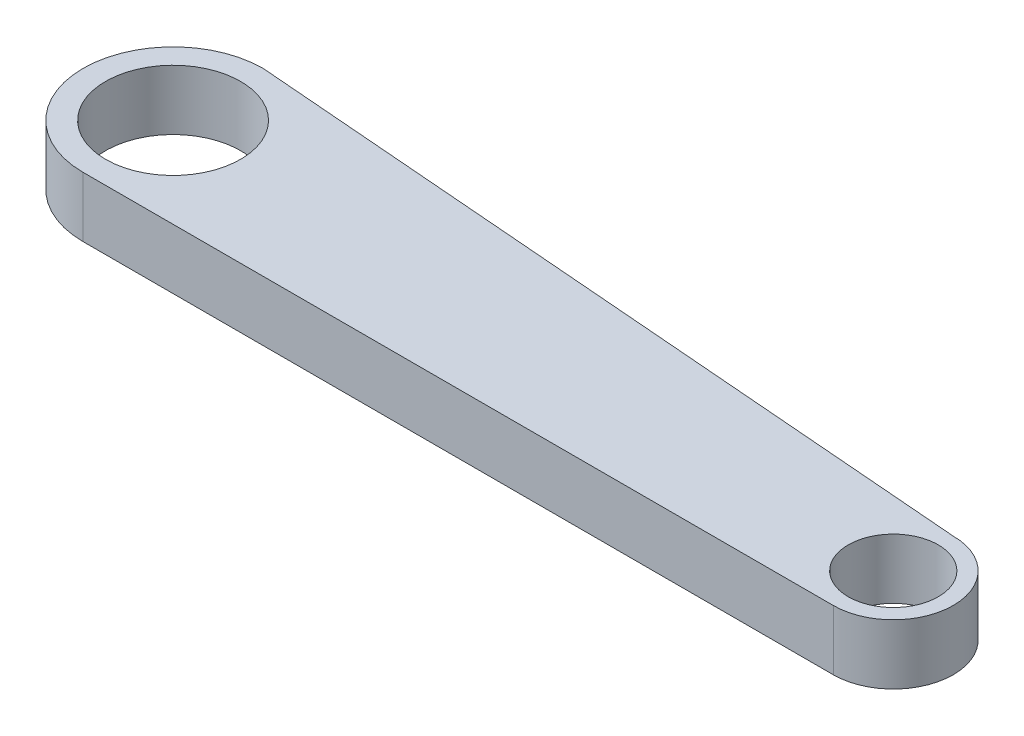
ISO-10303-21;
HEADER;
FILE_DESCRIPTION(('STEP AP214'),'2;1');
FILE_NAME('part.step','',(''),(''),'','','');
FILE_SCHEMA(('AUTOMOTIVE_DESIGN { 1 0 10303 214 1 1 1 1 }'));
ENDSEC;
DATA;
#1=APPLICATION_CONTEXT('core data for automotive mechanical design processes');
#2=APPLICATION_PROTOCOL_DEFINITION('international standard','automotive_design',2000,#1);
#3=PRODUCT_CONTEXT('',#1,'mechanical');
#4=PRODUCT('Part','Part','',(#3));
#5=PRODUCT_RELATED_PRODUCT_CATEGORY('part','',(#4));
#6=PRODUCT_DEFINITION_FORMATION('','',#4);
#7=PRODUCT_DEFINITION_CONTEXT('part definition',#1,'design');
#8=PRODUCT_DEFINITION('design','',#6,#7);
#9=PRODUCT_DEFINITION_SHAPE('','',#8);
#10=(LENGTH_UNIT() NAMED_UNIT(*) SI_UNIT(.MILLI.,.METRE.));
#11=(NAMED_UNIT(*) PLANE_ANGLE_UNIT() SI_UNIT($,.RADIAN.));
#12=(NAMED_UNIT(*) SI_UNIT($,.STERADIAN.) SOLID_ANGLE_UNIT());
#13=UNCERTAINTY_MEASURE_WITH_UNIT(LENGTH_MEASURE(1.E-05),#10,'distance_accuracy_value','');
#14=(GEOMETRIC_REPRESENTATION_CONTEXT(3) GLOBAL_UNCERTAINTY_ASSIGNED_CONTEXT((#13)) GLOBAL_UNIT_ASSIGNED_CONTEXT((#10,
#11,#12)) REPRESENTATION_CONTEXT('',''));
#15=CARTESIAN_POINT('',(0.,0.,0.));
#16=DIRECTION('',(0.,0.,1.));
#17=DIRECTION('',(1.,0.,0.));
#18=AXIS2_PLACEMENT_3D('',#15,#16,#17);
#19=CARTESIAN_POINT('',(800.,64.,31.9999999999999));
#20=DIRECTION('',(0.,-1.,0.));
#21=DIRECTION('',(0.,0.,-1.));
#22=AXIS2_PLACEMENT_3D('',#19,#20,#21);
#23=CYLINDRICAL_SURFACE('',#22,64.0000000000001);
#24=CARTESIAN_POINT('',(800.,0.,31.9999999999999));
#25=DIRECTION('',(0.,1.,0.));
#26=DIRECTION('',(0.,0.,1.));
#27=AXIS2_PLACEMENT_3D('',#24,#25,#26);
#28=CIRCLE('',#27,64.0000000000001);
#29=CARTESIAN_POINT('',(800.,0.,96.));
#30=VERTEX_POINT('',#29);
#31=CARTESIAN_POINT('',(800.,0.,-32.));
#32=VERTEX_POINT('',#31);
#33=EDGE_CURVE('E118',#30,#32,#28,.T.);
#34=ORIENTED_EDGE('',*,*,#33,.T.);
#35=DIRECTION('',(0.,-1.,0.));
#36=VECTOR('',#35,1.);
#37=CARTESIAN_POINT('',(800.,64.,-32.));
#38=LINE('',#37,#36);
#39=CARTESIAN_POINT('',(800.,64.,-32.));
#40=VERTEX_POINT('',#39);
#41=EDGE_CURVE('E11',#40,#32,#38,.T.);
#42=ORIENTED_EDGE('',*,*,#41,.F.);
#43=CARTESIAN_POINT('',(800.,64.,31.9999999999999));
#44=DIRECTION('',(0.,1.,0.));
#45=DIRECTION('',(0.,0.,1.));
#46=AXIS2_PLACEMENT_3D('',#43,#44,#45);
#47=CIRCLE('',#46,64.0000000000001);
#48=CARTESIAN_POINT('',(800.,64.,96.));
#49=VERTEX_POINT('',#48);
#50=EDGE_CURVE('E94',#49,#40,#47,.T.);
#51=ORIENTED_EDGE('',*,*,#50,.F.);
#52=DIRECTION('',(0.,-1.,0.));
#53=VECTOR('',#52,1.);
#54=CARTESIAN_POINT('',(800.,64.,96.));
#55=LINE('',#54,#53);
#56=EDGE_CURVE('E117',#49,#30,#55,.T.);
#57=ORIENTED_EDGE('',*,*,#56,.T.);
#58=EDGE_LOOP('',(#34,#42,#51,#57));
#59=FACE_BOUND('',#58,.T.);
#60=ADVANCED_FACE('F41',(#59),#23,.T.);
#61=CARTESIAN_POINT('',(7.63116057233704,64.,-95.3895071542131));
#62=DIRECTION('',(-0.07974522228289,0.,0.996815278536125));
#63=DIRECTION('',(0.996815278536125,0.,0.07974522228289));
#64=AXIS2_PLACEMENT_3D('',#61,#62,#63);
#65=PLANE('',#64);
#66=DIRECTION('',(-0.996815278536125,0.,-0.07974522228289));
#67=VECTOR('',#66,1.);
#68=CARTESIAN_POINT('',(7.63116057233704,0.,-95.3895071542131));
#69=LINE('',#68,#67);
#70=CARTESIAN_POINT('',(0.,0.,-96.));
#71=VERTEX_POINT('',#70);
#72=EDGE_CURVE('E99',#32,#71,#69,.T.);
#73=ORIENTED_EDGE('',*,*,#72,.T.);
#74=DIRECTION('',(0.,-1.,0.));
#75=VECTOR('',#74,1.);
#76=CARTESIAN_POINT('',(0.,64.,-96.));
#77=LINE('',#76,#75);
#78=CARTESIAN_POINT('',(0.,64.,-96.));
#79=VERTEX_POINT('',#78);
#80=EDGE_CURVE('E50',#79,#71,#77,.T.);
#81=ORIENTED_EDGE('',*,*,#80,.F.);
#82=DIRECTION('',(-0.996815278536125,0.,-0.07974522228289));
#83=VECTOR('',#82,1.);
#84=CARTESIAN_POINT('',(7.63116057233704,64.,-95.3895071542131));
#85=LINE('',#84,#83);
#86=EDGE_CURVE('E88',#40,#79,#85,.T.);
#87=ORIENTED_EDGE('',*,*,#86,.F.);
#88=ORIENTED_EDGE('',*,*,#41,.T.);
#89=EDGE_LOOP('',(#73,#81,#87,#88));
#90=FACE_BOUND('',#89,.T.);
#91=ADVANCED_FACE('F98',(#90),#65,.F.);
#92=CARTESIAN_POINT('',(0.,64.,0.));
#93=DIRECTION('',(0.,-1.,0.));
#94=DIRECTION('',(0.,0.,-1.));
#95=AXIS2_PLACEMENT_3D('',#92,#93,#94);
#96=CYLINDRICAL_SURFACE('',#95,96.);
#97=CARTESIAN_POINT('',(0.,0.,0.));
#98=DIRECTION('',(0.,1.,0.));
#99=DIRECTION('',(0.,0.,1.));
#100=AXIS2_PLACEMENT_3D('',#97,#98,#99);
#101=CIRCLE('',#100,96.);
#102=CARTESIAN_POINT('',(0.,0.,96.));
#103=VERTEX_POINT('',#102);
#104=EDGE_CURVE('E75',#71,#103,#101,.T.);
#105=ORIENTED_EDGE('',*,*,#104,.T.);
#106=DIRECTION('',(0.,-1.,0.));
#107=VECTOR('',#106,1.);
#108=CARTESIAN_POINT('',(0.,64.,96.));
#109=LINE('',#108,#107);
#110=CARTESIAN_POINT('',(0.,64.,96.));
#111=VERTEX_POINT('',#110);
#112=EDGE_CURVE('E101',#111,#103,#109,.T.);
#113=ORIENTED_EDGE('',*,*,#112,.F.);
#114=CARTESIAN_POINT('',(0.,64.,0.));
#115=DIRECTION('',(0.,1.,0.));
#116=DIRECTION('',(0.,0.,1.));
#117=AXIS2_PLACEMENT_3D('',#114,#115,#116);
#118=CIRCLE('',#117,96.);
#119=EDGE_CURVE('E92',#79,#111,#118,.T.);
#120=ORIENTED_EDGE('',*,*,#119,.F.);
#121=ORIENTED_EDGE('',*,*,#80,.T.);
#122=EDGE_LOOP('',(#105,#113,#120,#121));
#123=FACE_BOUND('',#122,.T.);
#124=ADVANCED_FACE('F102',(#123),#96,.T.);
#125=CARTESIAN_POINT('',(0.,64.,0.));
#126=DIRECTION('',(0.,-1.,0.));
#127=DIRECTION('',(0.,0.,-1.));
#128=AXIS2_PLACEMENT_3D('',#125,#126,#127);
#129=CYLINDRICAL_SURFACE('',#128,72.);
#130=CARTESIAN_POINT('',(0.,64.,0.));
#131=DIRECTION('',(0.,1.,0.));
#132=DIRECTION('',(0.,0.,1.));
#133=AXIS2_PLACEMENT_3D('',#130,#131,#132);
#134=CIRCLE('',#133,72.);
#135=CARTESIAN_POINT('',(0.,64.,72.));
#136=VERTEX_POINT('',#135);
#137=EDGE_CURVE('E106',#136,#136,#134,.T.);
#138=ORIENTED_EDGE('',*,*,#137,.T.);
#139=EDGE_LOOP('',(#138));
#140=FACE_BOUND('',#139,.T.);
#141=CARTESIAN_POINT('',(0.,0.,0.));
#142=DIRECTION('',(0.,1.,0.));
#143=DIRECTION('',(0.,0.,1.));
#144=AXIS2_PLACEMENT_3D('',#141,#142,#143);
#145=CIRCLE('',#144,72.);
#146=CARTESIAN_POINT('',(0.,0.,72.));
#147=VERTEX_POINT('',#146);
#148=EDGE_CURVE('E128',#147,#147,#145,.T.);
#149=ORIENTED_EDGE('',*,*,#148,.F.);
#150=EDGE_LOOP('',(#149));
#151=FACE_BOUND('',#150,.T.);
#152=ADVANCED_FACE('F153',(#140,#151),#129,.F.);
#153=CARTESIAN_POINT('',(0.,64.,96.));
#154=DIRECTION('',(0.,0.,-1.));
#155=DIRECTION('',(-1.,0.,0.));
#156=AXIS2_PLACEMENT_3D('',#153,#154,#155);
#157=PLANE('',#156);
#158=DIRECTION('',(1.,0.,0.));
#159=VECTOR('',#158,1.);
#160=CARTESIAN_POINT('',(0.,0.,96.));
#161=LINE('',#160,#159);
#162=EDGE_CURVE('E81',#103,#30,#161,.T.);
#163=ORIENTED_EDGE('',*,*,#162,.T.);
#164=ORIENTED_EDGE('',*,*,#56,.F.);
#165=DIRECTION('',(1.,0.,0.));
#166=VECTOR('',#165,1.);
#167=CARTESIAN_POINT('',(0.,64.,96.));
#168=LINE('',#167,#166);
#169=EDGE_CURVE('E58',#111,#49,#168,.T.);
#170=ORIENTED_EDGE('',*,*,#169,.F.);
#171=ORIENTED_EDGE('',*,*,#112,.T.);
#172=EDGE_LOOP('',(#163,#164,#170,#171));
#173=FACE_BOUND('',#172,.T.);
#174=ADVANCED_FACE('F139',(#173),#157,.F.);
#175=CARTESIAN_POINT('',(800.,64.,31.9999999999999));
#176=DIRECTION('',(0.,-1.,0.));
#177=DIRECTION('',(0.,0.,-1.));
#178=AXIS2_PLACEMENT_3D('',#175,#176,#177);
#179=CYLINDRICAL_SURFACE('',#178,48.0000000000001);
#180=CARTESIAN_POINT('',(800.,64.,31.9999999999999));
#181=DIRECTION('',(0.,1.,0.));
#182=DIRECTION('',(0.,0.,1.));
#183=AXIS2_PLACEMENT_3D('',#180,#181,#182);
#184=CIRCLE('',#183,48.0000000000001);
#185=CARTESIAN_POINT('',(800.,64.,80.0000000000001));
#186=VERTEX_POINT('',#185);
#187=EDGE_CURVE('E113',#186,#186,#184,.T.);
#188=ORIENTED_EDGE('',*,*,#187,.T.);
#189=EDGE_LOOP('',(#188));
#190=FACE_BOUND('',#189,.T.);
#191=CARTESIAN_POINT('',(800.,0.,31.9999999999999));
#192=DIRECTION('',(0.,1.,0.));
#193=DIRECTION('',(0.,0.,1.));
#194=AXIS2_PLACEMENT_3D('',#191,#192,#193);
#195=CIRCLE('',#194,48.0000000000001);
#196=CARTESIAN_POINT('',(800.,0.,80.0000000000001));
#197=VERTEX_POINT('',#196);
#198=EDGE_CURVE('E132',#197,#197,#195,.T.);
#199=ORIENTED_EDGE('',*,*,#198,.F.);
#200=EDGE_LOOP('',(#199));
#201=FACE_BOUND('',#200,.T.);
#202=ADVANCED_FACE('F158',(#190,#201),#179,.F.);
#203=CARTESIAN_POINT('',(0.,64.,0.));
#204=DIRECTION('',(0.,1.,0.));
#205=DIRECTION('',(0.,0.,1.));
#206=AXIS2_PLACEMENT_3D('',#203,#204,#205);
#207=PLANE('',#206);
#208=ORIENTED_EDGE('',*,*,#50,.T.);
#209=ORIENTED_EDGE('',*,*,#86,.T.);
#210=ORIENTED_EDGE('',*,*,#119,.T.);
#211=ORIENTED_EDGE('',*,*,#169,.T.);
#212=EDGE_LOOP('',(#208,#209,#210,#211));
#213=FACE_BOUND('',#212,.T.);
#214=ORIENTED_EDGE('',*,*,#137,.F.);
#215=EDGE_LOOP('',(#214));
#216=FACE_BOUND('',#215,.T.);
#217=ORIENTED_EDGE('',*,*,#187,.F.);
#218=EDGE_LOOP('',(#217));
#219=FACE_BOUND('',#218,.T.);
#220=ADVANCED_FACE('F89',(#213,#216,#219),#207,.T.);
#221=CARTESIAN_POINT('',(0.,0.,0.));
#222=DIRECTION('',(0.,1.,0.));
#223=DIRECTION('',(0.,0.,1.));
#224=AXIS2_PLACEMENT_3D('',#221,#222,#223);
#225=PLANE('',#224);
#226=ORIENTED_EDGE('',*,*,#33,.F.);
#227=ORIENTED_EDGE('',*,*,#162,.F.);
#228=ORIENTED_EDGE('',*,*,#104,.F.);
#229=ORIENTED_EDGE('',*,*,#72,.F.);
#230=EDGE_LOOP('',(#226,#227,#228,#229));
#231=FACE_BOUND('',#230,.T.);
#232=ORIENTED_EDGE('',*,*,#148,.T.);
#233=EDGE_LOOP('',(#232));
#234=FACE_BOUND('',#233,.T.);
#235=ORIENTED_EDGE('',*,*,#198,.T.);
#236=EDGE_LOOP('',(#235));
#237=FACE_BOUND('',#236,.T.);
#238=ADVANCED_FACE('F142',(#231,#234,#237),#225,.F.);
#239=CLOSED_SHELL('',(#60,#91,#124,#152,#174,#202,#220,#238));
#240=MANIFOLD_SOLID_BREP('B2',#239);
#241=ADVANCED_BREP_SHAPE_REPRESENTATION('',(#18,#240),#14);
#242=SHAPE_DEFINITION_REPRESENTATION(#9,#241);
ENDSEC;
END-ISO-10303-21;
